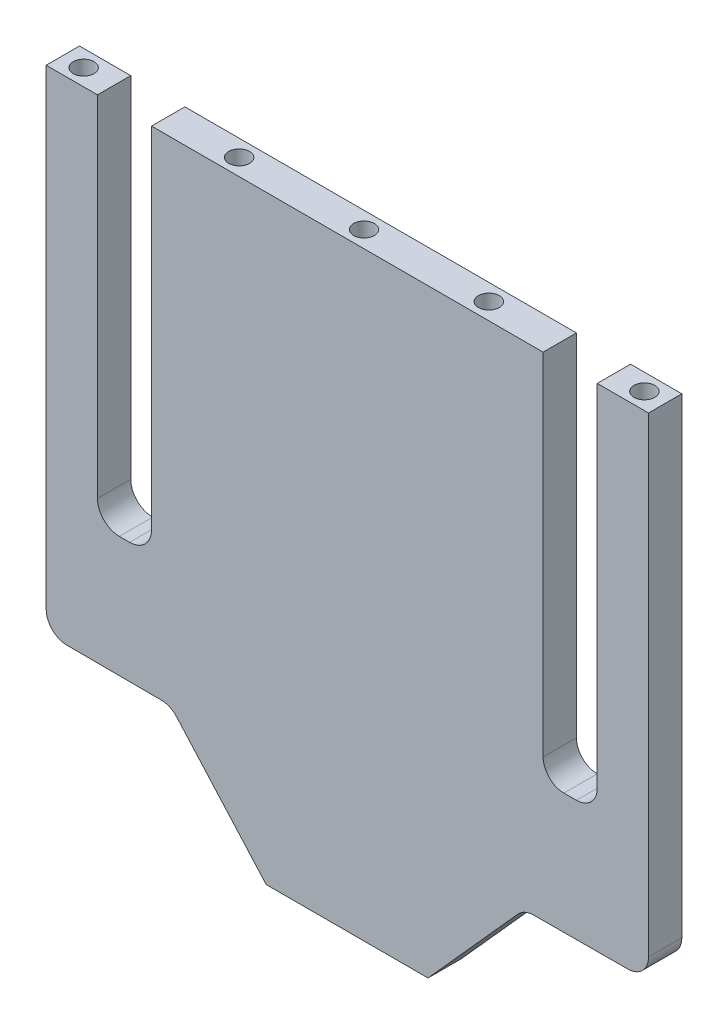
ISO-10303-21;
HEADER;
FILE_DESCRIPTION(('STEP AP214'),'2;1');
FILE_NAME('part.step','',(''),(''),'','','');
FILE_SCHEMA(('AUTOMOTIVE_DESIGN { 1 0 10303 214 1 1 1 1 }'));
ENDSEC;
DATA;
#1=APPLICATION_CONTEXT('core data for automotive mechanical design processes');
#2=APPLICATION_PROTOCOL_DEFINITION('international standard','automotive_design',2000,#1);
#3=PRODUCT_CONTEXT('',#1,'mechanical');
#4=PRODUCT('Part','Part','',(#3));
#5=PRODUCT_RELATED_PRODUCT_CATEGORY('part','',(#4));
#6=PRODUCT_DEFINITION_FORMATION('','',#4);
#7=PRODUCT_DEFINITION_CONTEXT('part definition',#1,'design');
#8=PRODUCT_DEFINITION('design','',#6,#7);
#9=PRODUCT_DEFINITION_SHAPE('','',#8);
#10=(LENGTH_UNIT() NAMED_UNIT(*) SI_UNIT(.MILLI.,.METRE.));
#11=(NAMED_UNIT(*) PLANE_ANGLE_UNIT() SI_UNIT($,.RADIAN.));
#12=(NAMED_UNIT(*) SI_UNIT($,.STERADIAN.) SOLID_ANGLE_UNIT());
#13=UNCERTAINTY_MEASURE_WITH_UNIT(LENGTH_MEASURE(1.E-05),#10,'distance_accuracy_value','');
#14=(GEOMETRIC_REPRESENTATION_CONTEXT(3) GLOBAL_UNCERTAINTY_ASSIGNED_CONTEXT((#13)) GLOBAL_UNIT_ASSIGNED_CONTEXT((#10,
#11,#12)) REPRESENTATION_CONTEXT('',''));
#15=CARTESIAN_POINT('',(0.,0.,0.));
#16=DIRECTION('',(0.,0.,1.));
#17=DIRECTION('',(1.,0.,0.));
#18=AXIS2_PLACEMENT_3D('',#15,#16,#17);
#19=CARTESIAN_POINT('',(142.361429131202,144.052259170068,8.01));
#20=DIRECTION('',(0.,-1.,0.));
#21=DIRECTION('',(0.,0.,-1.));
#22=AXIS2_PLACEMENT_3D('',#19,#20,#21);
#23=PLANE('',#22);
#24=CARTESIAN_POINT('',(2.63857086880265,144.052259170068,4.));
#25=DIRECTION('',(0.,-1.,0.));
#26=DIRECTION('',(0.,0.,-1.));
#27=AXIS2_PLACEMENT_3D('',#24,#25,#26);
#28=CIRCLE('',#27,2.5);
#29=CARTESIAN_POINT('',(2.63857086880265,144.052259170068,1.5));
#30=VERTEX_POINT('',#29);
#31=EDGE_CURVE('E467',#30,#30,#28,.T.);
#32=ORIENTED_EDGE('',*,*,#31,.T.);
#33=EDGE_LOOP('',(#32));
#34=FACE_BOUND('',#33,.T.);
#35=DIRECTION('',(1.,0.,0.));
#36=VECTOR('',#35,1.);
#37=CARTESIAN_POINT('',(114.734330831104,144.052259170068,8.));
#38=LINE('',#37,#36);
#39=CARTESIAN_POINT('',(-2.3614291311915,144.052259170068,8.));
#40=VERTEX_POINT('',#39);
#41=CARTESIAN_POINT('',(9.96045656366648,144.052259170068,8.));
#42=VERTEX_POINT('',#41);
#43=EDGE_CURVE('E375',#40,#42,#38,.T.);
#44=ORIENTED_EDGE('',*,*,#43,.T.);
#45=DIRECTION('',(0.,0.,-1.));
#46=VECTOR('',#45,1.);
#47=CARTESIAN_POINT('',(9.96045656366648,144.052259170068,8.));
#48=LINE('',#47,#46);
#49=CARTESIAN_POINT('',(9.96045656366648,144.052259170068,0.));
#50=VERTEX_POINT('',#49);
#51=EDGE_CURVE('E45',#42,#50,#48,.T.);
#52=ORIENTED_EDGE('',*,*,#51,.T.);
#53=DIRECTION('',(1.,0.,0.));
#54=VECTOR('',#53,1.);
#55=CARTESIAN_POINT('',(114.734330831104,144.052259170068,0.));
#56=LINE('',#55,#54);
#57=CARTESIAN_POINT('',(-2.3614291311915,144.052259170068,0.));
#58=VERTEX_POINT('',#57);
#59=EDGE_CURVE('E372',#58,#50,#56,.T.);
#60=ORIENTED_EDGE('',*,*,#59,.F.);
#61=DIRECTION('',(0.,0.,-1.));
#62=VECTOR('',#61,1.);
#63=CARTESIAN_POINT('',(-2.3614291311915,144.052259170068,8.));
#64=LINE('',#63,#62);
#65=EDGE_CURVE('E365',#40,#58,#64,.T.);
#66=ORIENTED_EDGE('',*,*,#65,.F.);
#67=EDGE_LOOP('',(#44,#52,#60,#66));
#68=FACE_BOUND('',#67,.T.);
#69=ADVANCED_FACE('F41',(#34,#68),#23,.F.);
#70=CARTESIAN_POINT('',(137.361429131207,144.052259170068,4.));
#71=DIRECTION('',(0.,-1.,0.));
#72=DIRECTION('',(0.,0.,-1.));
#73=AXIS2_PLACEMENT_3D('',#70,#71,#72);
#74=CIRCLE('',#73,2.5);
#75=CARTESIAN_POINT('',(137.361429131207,144.052259170068,1.50000000000001));
#76=VERTEX_POINT('',#75);
#77=EDGE_CURVE('E488',#76,#76,#74,.T.);
#78=ORIENTED_EDGE('',*,*,#77,.T.);
#79=EDGE_LOOP('',(#78));
#80=FACE_BOUND('',#79,.T.);
#81=CARTESIAN_POINT('',(130.039543436344,144.052259170068,8.));
#82=VERTEX_POINT('',#81);
#83=CARTESIAN_POINT('',(142.361429131201,144.052259170068,8.));
#84=VERTEX_POINT('',#83);
#85=EDGE_CURVE('E229',#82,#84,#38,.T.);
#86=ORIENTED_EDGE('',*,*,#85,.T.);
#87=DIRECTION('',(0.,0.,1.));
#88=VECTOR('',#87,1.);
#89=CARTESIAN_POINT('',(142.361429131201,144.052259170068,8.));
#90=LINE('',#89,#88);
#91=CARTESIAN_POINT('',(142.361429131201,144.052259170068,0.));
#92=VERTEX_POINT('',#91);
#93=EDGE_CURVE('E368',#92,#84,#90,.T.);
#94=ORIENTED_EDGE('',*,*,#93,.F.);
#95=CARTESIAN_POINT('',(130.039543436344,144.052259170068,0.));
#96=VERTEX_POINT('',#95);
#97=EDGE_CURVE('E370',#96,#92,#56,.T.);
#98=ORIENTED_EDGE('',*,*,#97,.F.);
#99=DIRECTION('',(0.,0.,1.));
#100=VECTOR('',#99,1.);
#101=CARTESIAN_POINT('',(130.039543436344,144.052259170068,8.));
#102=LINE('',#101,#100);
#103=EDGE_CURVE('E50',#96,#82,#102,.T.);
#104=ORIENTED_EDGE('',*,*,#103,.T.);
#105=EDGE_LOOP('',(#86,#94,#98,#104));
#106=FACE_BOUND('',#105,.T.);
#107=ADVANCED_FACE('F380',(#80,#106),#23,.F.);
#108=CARTESIAN_POINT('',(40.,144.052259170068,4.));
#109=DIRECTION('',(0.,-1.,0.));
#110=DIRECTION('',(0.,0.,-1.));
#111=AXIS2_PLACEMENT_3D('',#108,#109,#110);
#112=CIRCLE('',#111,2.5);
#113=CARTESIAN_POINT('',(40.,144.052259170068,1.50000000000001));
#114=VERTEX_POINT('',#113);
#115=EDGE_CURVE('E469',#114,#114,#112,.T.);
#116=ORIENTED_EDGE('',*,*,#115,.T.);
#117=EDGE_LOOP('',(#116));
#118=FACE_BOUND('',#117,.T.);
#119=CARTESIAN_POINT('',(70.,144.052259170068,4.));
#120=DIRECTION('',(0.,-1.,0.));
#121=DIRECTION('',(0.,0.,-1.));
#122=AXIS2_PLACEMENT_3D('',#119,#120,#121);
#123=CIRCLE('',#122,2.5);
#124=CARTESIAN_POINT('',(70.,144.052259170068,1.50000000000001));
#125=VERTEX_POINT('',#124);
#126=EDGE_CURVE('E476',#125,#125,#123,.T.);
#127=ORIENTED_EDGE('',*,*,#126,.T.);
#128=EDGE_LOOP('',(#127));
#129=FACE_BOUND('',#128,.T.);
#130=CARTESIAN_POINT('',(100.,144.052259170068,4.));
#131=DIRECTION('',(0.,-1.,0.));
#132=DIRECTION('',(0.,0.,-1.));
#133=AXIS2_PLACEMENT_3D('',#130,#131,#132);
#134=CIRCLE('',#133,2.5);
#135=CARTESIAN_POINT('',(100.,144.052259170068,1.50000000000001));
#136=VERTEX_POINT('',#135);
#137=EDGE_CURVE('E482',#136,#136,#134,.T.);
#138=ORIENTED_EDGE('',*,*,#137,.T.);
#139=EDGE_LOOP('',(#138));
#140=FACE_BOUND('',#139,.T.);
#141=DIRECTION('',(0.,0.,1.));
#142=VECTOR('',#141,1.);
#143=CARTESIAN_POINT('',(22.9604457068742,144.052259170068,8.));
#144=LINE('',#143,#142);
#145=CARTESIAN_POINT('',(22.9604457068742,144.052259170068,0.));
#146=VERTEX_POINT('',#145);
#147=CARTESIAN_POINT('',(22.9604457068742,144.052259170068,8.));
#148=VERTEX_POINT('',#147);
#149=EDGE_CURVE('E376',#146,#148,#144,.T.);
#150=ORIENTED_EDGE('',*,*,#149,.T.);
#151=CARTESIAN_POINT('',(117.039554293136,144.052259170068,8.));
#152=VERTEX_POINT('',#151);
#153=EDGE_CURVE('E374',#148,#152,#38,.T.);
#154=ORIENTED_EDGE('',*,*,#153,.T.);
#155=DIRECTION('',(0.,0.,-1.));
#156=VECTOR('',#155,1.);
#157=CARTESIAN_POINT('',(117.039554293136,144.052259170068,8.));
#158=LINE('',#157,#156);
#159=CARTESIAN_POINT('',(117.039554293136,144.052259170068,0.));
#160=VERTEX_POINT('',#159);
#161=EDGE_CURVE('E11',#152,#160,#158,.T.);
#162=ORIENTED_EDGE('',*,*,#161,.T.);
#163=EDGE_CURVE('E58',#146,#160,#56,.T.);
#164=ORIENTED_EDGE('',*,*,#163,.F.);
#165=EDGE_LOOP('',(#150,#154,#162,#164));
#166=FACE_BOUND('',#165,.T.);
#167=ADVANCED_FACE('F43',(#118,#129,#140,#166),#23,.F.);
#168=CARTESIAN_POINT('',(114.734330831104,20.7823478267735,8.));
#169=DIRECTION('',(0.,0.,1.));
#170=DIRECTION('',(1.,0.,0.));
#171=AXIS2_PLACEMENT_3D('',#168,#169,#170);
#172=PLANE('',#171);
#173=ORIENTED_EDGE('',*,*,#43,.F.);
#174=DIRECTION('',(0.,-1.,0.));
#175=VECTOR('',#174,1.);
#176=CARTESIAN_POINT('',(-2.3614291311915,214.274017901078,8.));
#177=LINE('',#176,#175);
#178=CARTESIAN_POINT('',(-2.36142913119149,30.8599431741363,8.));
#179=VERTEX_POINT('',#178);
#180=EDGE_CURVE('E306',#40,#179,#177,.T.);
#181=ORIENTED_EDGE('',*,*,#180,.T.);
#182=CARTESIAN_POINT('',(2.63857086880851,30.8599431741363,8.));
#183=DIRECTION('',(0.,0.,1.));
#184=DIRECTION('',(-1.,0.,0.));
#185=AXIS2_PLACEMENT_3D('',#182,#183,#184);
#186=CIRCLE('',#185,5.);
#187=CARTESIAN_POINT('',(2.63857086880812,25.8599431741363,8.));
#188=VERTEX_POINT('',#187);
#189=EDGE_CURVE('E308',#179,#188,#186,.T.);
#190=ORIENTED_EDGE('',*,*,#189,.T.);
#191=DIRECTION('',(0.999994124417924,-0.00342799206976642,0.));
#192=VECTOR('',#191,1.);
#193=CARTESIAN_POINT('',(25.2828091292453,25.7823184488632,8.));
#194=LINE('',#193,#192);
#195=CARTESIAN_POINT('',(25.2828091292453,25.7823184488632,8.));
#196=VERTEX_POINT('',#195);
#197=EDGE_CURVE('E310',#188,#196,#194,.T.);
#198=ORIENTED_EDGE('',*,*,#197,.T.);
#199=CARTESIAN_POINT('',(25.2656691688965,20.7823478267735,8.));
#200=DIRECTION('',(0.,0.,-1.));
#201=DIRECTION('',(-1.,0.,0.));
#202=AXIS2_PLACEMENT_3D('',#199,#200,#201);
#203=CIRCLE('',#202,5.);
#204=CARTESIAN_POINT('',(28.9972260111802,24.1103327325094,8.));
#205=VERTEX_POINT('',#204);
#206=EDGE_CURVE('E312',#196,#205,#203,.T.);
#207=ORIENTED_EDGE('',*,*,#206,.T.);
#208=DIRECTION('',(0.665596981147171,-0.74631136845674,0.));
#209=VECTOR('',#208,1.);
#210=CARTESIAN_POINT('',(28.9972260111802,24.1103327325094,8.));
#211=LINE('',#210,#209);
#212=CARTESIAN_POINT('',(50.5,0.,8.));
#213=VERTEX_POINT('',#212);
#214=EDGE_CURVE('E290',#205,#213,#211,.T.);
#215=ORIENTED_EDGE('',*,*,#214,.T.);
#216=DIRECTION('',(1.,0.,0.));
#217=VECTOR('',#216,1.);
#218=CARTESIAN_POINT('',(89.3828592898621,0.,8.));
#219=LINE('',#218,#217);
#220=CARTESIAN_POINT('',(89.3828592898621,0.,8.));
#221=VERTEX_POINT('',#220);
#222=EDGE_CURVE('E293',#213,#221,#219,.T.);
#223=ORIENTED_EDGE('',*,*,#222,.T.);
#224=DIRECTION('',(0.667609283497738,0.744511816284763,0.));
#225=VECTOR('',#224,1.);
#226=CARTESIAN_POINT('',(89.3828592898621,0.,8.));
#227=LINE('',#226,#225);
#228=CARTESIAN_POINT('',(111.00277398882,24.1103327325094,8.));
#229=VERTEX_POINT('',#228);
#230=EDGE_CURVE('E296',#221,#229,#227,.T.);
#231=ORIENTED_EDGE('',*,*,#230,.T.);
#232=CARTESIAN_POINT('',(114.734330831104,20.7823478267735,8.));
#233=DIRECTION('',(0.,0.,-1.));
#234=DIRECTION('',(1.,0.,0.));
#235=AXIS2_PLACEMENT_3D('',#232,#233,#234);
#236=CIRCLE('',#235,5.);
#237=CARTESIAN_POINT('',(114.717190870755,25.7823184488632,8.));
#238=VERTEX_POINT('',#237);
#239=EDGE_CURVE('E298',#229,#238,#236,.T.);
#240=ORIENTED_EDGE('',*,*,#239,.T.);
#241=DIRECTION('',(0.999994124417924,0.00342799206976557,0.));
#242=VECTOR('',#241,1.);
#243=CARTESIAN_POINT('',(114.717190870755,25.7823184488632,8.));
#244=LINE('',#243,#242);
#245=CARTESIAN_POINT('',(137.361429131203,25.8599431741363,8.));
#246=VERTEX_POINT('',#245);
#247=EDGE_CURVE('E300',#238,#246,#244,.T.);
#248=ORIENTED_EDGE('',*,*,#247,.T.);
#249=CARTESIAN_POINT('',(137.361429131202,30.8599431741363,8.));
#250=DIRECTION('',(0.,0.,1.));
#251=DIRECTION('',(1.,0.,0.));
#252=AXIS2_PLACEMENT_3D('',#249,#250,#251);
#253=CIRCLE('',#252,4.99999999999935);
#254=CARTESIAN_POINT('',(142.361429131202,30.8599431741363,8.));
#255=VERTEX_POINT('',#254);
#256=EDGE_CURVE('E302',#246,#255,#253,.T.);
#257=ORIENTED_EDGE('',*,*,#256,.T.);
#258=DIRECTION('',(0.,1.,0.));
#259=VECTOR('',#258,1.);
#260=CARTESIAN_POINT('',(142.361429131201,214.274017901078,8.));
#261=LINE('',#260,#259);
#262=EDGE_CURVE('E304',#255,#84,#261,.T.);
#263=ORIENTED_EDGE('',*,*,#262,.T.);
#264=ORIENTED_EDGE('',*,*,#85,.F.);
#265=DIRECTION('',(0.,1.,0.));
#266=VECTOR('',#265,1.);
#267=CARTESIAN_POINT('',(130.039543436344,189.807228462391,8.));
#268=LINE('',#267,#266);
#269=CARTESIAN_POINT('',(130.039543436344,59.8072284623908,8.));
#270=VERTEX_POINT('',#269);
#271=EDGE_CURVE('E213',#270,#82,#268,.T.);
#272=ORIENTED_EDGE('',*,*,#271,.F.);
#273=CARTESIAN_POINT('',(125.039543436344,59.8072284623908,8.));
#274=DIRECTION('',(0.,0.,1.));
#275=DIRECTION('',(1.,0.,0.));
#276=AXIS2_PLACEMENT_3D('',#273,#274,#275);
#277=CIRCLE('',#276,5.);
#278=CARTESIAN_POINT('',(125.039543436344,54.8072284623908,8.));
#279=VERTEX_POINT('',#278);
#280=EDGE_CURVE('E203',#279,#270,#277,.T.);
#281=ORIENTED_EDGE('',*,*,#280,.F.);
#282=DIRECTION('',(1.,0.,0.));
#283=VECTOR('',#282,1.);
#284=CARTESIAN_POINT('',(125.039543436344,54.8072284623908,8.));
#285=LINE('',#284,#283);
#286=CARTESIAN_POINT('',(122.039554293136,54.8072284623908,8.));
#287=VERTEX_POINT('',#286);
#288=EDGE_CURVE('E238',#287,#279,#285,.T.);
#289=ORIENTED_EDGE('',*,*,#288,.F.);
#290=CARTESIAN_POINT('',(122.039554293136,59.8072284623908,8.));
#291=DIRECTION('',(0.,0.,1.));
#292=DIRECTION('',(-1.,0.,0.));
#293=AXIS2_PLACEMENT_3D('',#290,#291,#292);
#294=CIRCLE('',#293,4.99999999999999);
#295=CARTESIAN_POINT('',(117.039554293137,59.8072284623908,8.));
#296=VERTEX_POINT('',#295);
#297=EDGE_CURVE('E232',#296,#287,#294,.T.);
#298=ORIENTED_EDGE('',*,*,#297,.F.);
#299=DIRECTION('',(0.,-1.,0.));
#300=VECTOR('',#299,1.);
#301=CARTESIAN_POINT('',(117.039554293137,59.8072284623908,8.));
#302=LINE('',#301,#300);
#303=EDGE_CURVE('E230',#152,#296,#302,.T.);
#304=ORIENTED_EDGE('',*,*,#303,.F.);
#305=ORIENTED_EDGE('',*,*,#153,.F.);
#306=DIRECTION('',(0.,1.,0.));
#307=VECTOR('',#306,1.);
#308=CARTESIAN_POINT('',(22.9604457068742,60.0655706645121,8.));
#309=LINE('',#308,#307);
#310=CARTESIAN_POINT('',(22.9604457068742,60.0655706645121,8.));
#311=VERTEX_POINT('',#310);
#312=EDGE_CURVE('E266',#311,#148,#309,.T.);
#313=ORIENTED_EDGE('',*,*,#312,.F.);
#314=CARTESIAN_POINT('',(17.7021035047529,60.0655706645121,8.));
#315=DIRECTION('',(0.,0.,1.));
#316=DIRECTION('',(1.,0.,0.));
#317=AXIS2_PLACEMENT_3D('',#314,#315,#316);
#318=CIRCLE('',#317,5.25834220212128);
#319=CARTESIAN_POINT('',(17.7021035047529,54.8072284623908,8.));
#320=VERTEX_POINT('',#319);
#321=EDGE_CURVE('E263',#320,#311,#318,.T.);
#322=ORIENTED_EDGE('',*,*,#321,.F.);
#323=DIRECTION('',(1.,0.,0.));
#324=VECTOR('',#323,1.);
#325=CARTESIAN_POINT('',(15.2187987657878,54.8072284623908,8.));
#326=LINE('',#325,#324);
#327=CARTESIAN_POINT('',(15.2187987657878,54.8072284623908,8.));
#328=VERTEX_POINT('',#327);
#329=EDGE_CURVE('E261',#328,#320,#326,.T.);
#330=ORIENTED_EDGE('',*,*,#329,.F.);
#331=CARTESIAN_POINT('',(15.2187987657878,60.0655706645121,8.));
#332=DIRECTION('',(0.,0.,1.));
#333=DIRECTION('',(-1.,0.,0.));
#334=AXIS2_PLACEMENT_3D('',#331,#332,#333);
#335=CIRCLE('',#334,5.25834220212128);
#336=CARTESIAN_POINT('',(9.96045656366648,60.0655706645121,8.));
#337=VERTEX_POINT('',#336);
#338=EDGE_CURVE('E258',#337,#328,#335,.T.);
#339=ORIENTED_EDGE('',*,*,#338,.F.);
#340=DIRECTION('',(0.,-1.,0.));
#341=VECTOR('',#340,1.);
#342=CARTESIAN_POINT('',(9.96045656366648,189.807228462391,8.));
#343=LINE('',#342,#341);
#344=EDGE_CURVE('E256',#42,#337,#343,.T.);
#345=ORIENTED_EDGE('',*,*,#344,.F.);
#346=EDGE_LOOP('',(#173,#181,#190,#198,#207,#215,#223,#231,#240,#248,#257,#263,#264,#272,#281,
#289,#298,#304,#305,#313,#322,#330,#339,#345));
#347=FACE_BOUND('',#346,.T.);
#348=ADVANCED_FACE('F226',(#347),#172,.T.);
#349=CARTESIAN_POINT('',(114.734330831104,20.7823478267735,0.));
#350=DIRECTION('',(0.,0.,1.));
#351=DIRECTION('',(1.,0.,0.));
#352=AXIS2_PLACEMENT_3D('',#349,#350,#351);
#353=PLANE('',#352);
#354=DIRECTION('',(0.,-1.,0.));
#355=VECTOR('',#354,1.);
#356=CARTESIAN_POINT('',(-2.3614291311915,214.274017901078,0.));
#357=LINE('',#356,#355);
#358=CARTESIAN_POINT('',(-2.36142913119149,30.8599431741363,0.));
#359=VERTEX_POINT('',#358);
#360=EDGE_CURVE('E330',#58,#359,#357,.T.);
#361=ORIENTED_EDGE('',*,*,#360,.F.);
#362=ORIENTED_EDGE('',*,*,#59,.T.);
#363=DIRECTION('',(0.,-1.,0.));
#364=VECTOR('',#363,1.);
#365=CARTESIAN_POINT('',(9.96045656366648,189.807228462391,0.));
#366=LINE('',#365,#364);
#367=CARTESIAN_POINT('',(9.96045656366648,60.0655706645121,0.));
#368=VERTEX_POINT('',#367);
#369=EDGE_CURVE('E221',#50,#368,#366,.T.);
#370=ORIENTED_EDGE('',*,*,#369,.T.);
#371=CARTESIAN_POINT('',(15.2187987657878,60.0655706645121,0.));
#372=DIRECTION('',(0.,0.,1.));
#373=DIRECTION('',(-1.,0.,0.));
#374=AXIS2_PLACEMENT_3D('',#371,#372,#373);
#375=CIRCLE('',#374,5.25834220212128);
#376=CARTESIAN_POINT('',(15.2187987657878,54.8072284623908,0.));
#377=VERTEX_POINT('',#376);
#378=EDGE_CURVE('E271',#368,#377,#375,.T.);
#379=ORIENTED_EDGE('',*,*,#378,.T.);
#380=DIRECTION('',(1.,0.,0.));
#381=VECTOR('',#380,1.);
#382=CARTESIAN_POINT('',(15.2187987657878,54.8072284623908,0.));
#383=LINE('',#382,#381);
#384=CARTESIAN_POINT('',(17.7021035047529,54.8072284623908,0.));
#385=VERTEX_POINT('',#384);
#386=EDGE_CURVE('E274',#377,#385,#383,.T.);
#387=ORIENTED_EDGE('',*,*,#386,.T.);
#388=CARTESIAN_POINT('',(17.7021035047529,60.0655706645121,0.));
#389=DIRECTION('',(0.,0.,1.));
#390=DIRECTION('',(1.,0.,0.));
#391=AXIS2_PLACEMENT_3D('',#388,#389,#390);
#392=CIRCLE('',#391,5.25834220212128);
#393=CARTESIAN_POINT('',(22.9604457068742,60.0655706645121,0.));
#394=VERTEX_POINT('',#393);
#395=EDGE_CURVE('E277',#385,#394,#392,.T.);
#396=ORIENTED_EDGE('',*,*,#395,.T.);
#397=DIRECTION('',(0.,1.,0.));
#398=VECTOR('',#397,1.);
#399=CARTESIAN_POINT('',(22.9604457068742,60.0655706645121,0.));
#400=LINE('',#399,#398);
#401=EDGE_CURVE('E259',#394,#146,#400,.T.);
#402=ORIENTED_EDGE('',*,*,#401,.T.);
#403=ORIENTED_EDGE('',*,*,#163,.T.);
#404=DIRECTION('',(0.,-1.,0.));
#405=VECTOR('',#404,1.);
#406=CARTESIAN_POINT('',(117.039554293137,59.8072284623908,0.));
#407=LINE('',#406,#405);
#408=CARTESIAN_POINT('',(117.039554293137,59.8072284623908,0.));
#409=VERTEX_POINT('',#408);
#410=EDGE_CURVE('E244',#160,#409,#407,.T.);
#411=ORIENTED_EDGE('',*,*,#410,.T.);
#412=CARTESIAN_POINT('',(122.039554293136,59.8072284623908,0.));
#413=DIRECTION('',(0.,0.,1.));
#414=DIRECTION('',(-1.,0.,0.));
#415=AXIS2_PLACEMENT_3D('',#412,#413,#414);
#416=CIRCLE('',#415,4.99999999999999);
#417=CARTESIAN_POINT('',(122.039554293136,54.8072284623908,0.));
#418=VERTEX_POINT('',#417);
#419=EDGE_CURVE('E246',#409,#418,#416,.T.);
#420=ORIENTED_EDGE('',*,*,#419,.T.);
#421=DIRECTION('',(1.,0.,0.));
#422=VECTOR('',#421,1.);
#423=CARTESIAN_POINT('',(125.039543436344,54.8072284623908,0.));
#424=LINE('',#423,#422);
#425=CARTESIAN_POINT('',(125.039543436344,54.8072284623908,0.));
#426=VERTEX_POINT('',#425);
#427=EDGE_CURVE('E214',#418,#426,#424,.T.);
#428=ORIENTED_EDGE('',*,*,#427,.T.);
#429=CARTESIAN_POINT('',(125.039543436344,59.8072284623908,0.));
#430=DIRECTION('',(0.,0.,1.));
#431=DIRECTION('',(1.,0.,0.));
#432=AXIS2_PLACEMENT_3D('',#429,#430,#431);
#433=CIRCLE('',#432,5.);
#434=CARTESIAN_POINT('',(130.039543436344,59.8072284623908,0.));
#435=VERTEX_POINT('',#434);
#436=EDGE_CURVE('E240',#426,#435,#433,.T.);
#437=ORIENTED_EDGE('',*,*,#436,.T.);
#438=DIRECTION('',(0.,1.,0.));
#439=VECTOR('',#438,1.);
#440=CARTESIAN_POINT('',(130.039543436344,189.807228462391,0.));
#441=LINE('',#440,#439);
#442=EDGE_CURVE('E220',#435,#96,#441,.T.);
#443=ORIENTED_EDGE('',*,*,#442,.T.);
#444=ORIENTED_EDGE('',*,*,#97,.T.);
#445=DIRECTION('',(0.,1.,0.));
#446=VECTOR('',#445,1.);
#447=CARTESIAN_POINT('',(142.361429131201,214.274017901078,0.));
#448=LINE('',#447,#446);
#449=CARTESIAN_POINT('',(142.361429131202,30.8599431741363,0.));
#450=VERTEX_POINT('',#449);
#451=EDGE_CURVE('E327',#450,#92,#448,.T.);
#452=ORIENTED_EDGE('',*,*,#451,.F.);
#453=CARTESIAN_POINT('',(137.361429131202,30.8599431741363,0.));
#454=DIRECTION('',(0.,0.,1.));
#455=DIRECTION('',(1.,0.,0.));
#456=AXIS2_PLACEMENT_3D('',#453,#454,#455);
#457=CIRCLE('',#456,4.99999999999935);
#458=CARTESIAN_POINT('',(137.361429131203,25.8599431741363,0.));
#459=VERTEX_POINT('',#458);
#460=EDGE_CURVE('E325',#459,#450,#457,.T.);
#461=ORIENTED_EDGE('',*,*,#460,.F.);
#462=DIRECTION('',(0.999994124417924,0.00342799206976557,0.));
#463=VECTOR('',#462,1.);
#464=CARTESIAN_POINT('',(114.717190870755,25.7823184488632,0.));
#465=LINE('',#464,#463);
#466=CARTESIAN_POINT('',(114.717190870755,25.7823184488632,0.));
#467=VERTEX_POINT('',#466);
#468=EDGE_CURVE('E323',#467,#459,#465,.T.);
#469=ORIENTED_EDGE('',*,*,#468,.F.);
#470=CARTESIAN_POINT('',(114.734330831104,20.7823478267735,0.));
#471=DIRECTION('',(0.,0.,-1.));
#472=DIRECTION('',(1.,0.,0.));
#473=AXIS2_PLACEMENT_3D('',#470,#471,#472);
#474=CIRCLE('',#473,5.);
#475=CARTESIAN_POINT('',(111.00277398882,24.1103327325094,0.));
#476=VERTEX_POINT('',#475);
#477=EDGE_CURVE('E321',#476,#467,#474,.T.);
#478=ORIENTED_EDGE('',*,*,#477,.F.);
#479=DIRECTION('',(0.667609283497738,0.744511816284763,0.));
#480=VECTOR('',#479,1.);
#481=CARTESIAN_POINT('',(89.3828592898621,0.,0.));
#482=LINE('',#481,#480);
#483=CARTESIAN_POINT('',(89.3828592898621,0.,0.));
#484=VERTEX_POINT('',#483);
#485=EDGE_CURVE('E319',#484,#476,#482,.T.);
#486=ORIENTED_EDGE('',*,*,#485,.F.);
#487=DIRECTION('',(1.,0.,0.));
#488=VECTOR('',#487,1.);
#489=CARTESIAN_POINT('',(89.3828592898621,0.,0.));
#490=LINE('',#489,#488);
#491=CARTESIAN_POINT('',(50.5,0.,0.));
#492=VERTEX_POINT('',#491);
#493=EDGE_CURVE('E317',#492,#484,#490,.T.);
#494=ORIENTED_EDGE('',*,*,#493,.F.);
#495=DIRECTION('',(0.665596981147171,-0.74631136845674,0.));
#496=VECTOR('',#495,1.);
#497=CARTESIAN_POINT('',(28.9972260111802,24.1103327325094,0.));
#498=LINE('',#497,#496);
#499=CARTESIAN_POINT('',(28.9972260111802,24.1103327325094,0.));
#500=VERTEX_POINT('',#499);
#501=EDGE_CURVE('E289',#500,#492,#498,.T.);
#502=ORIENTED_EDGE('',*,*,#501,.F.);
#503=CARTESIAN_POINT('',(25.2656691688965,20.7823478267735,0.));
#504=DIRECTION('',(0.,0.,-1.));
#505=DIRECTION('',(-1.,0.,0.));
#506=AXIS2_PLACEMENT_3D('',#503,#504,#505);
#507=CIRCLE('',#506,5.);
#508=CARTESIAN_POINT('',(25.2828091292453,25.7823184488632,0.));
#509=VERTEX_POINT('',#508);
#510=EDGE_CURVE('E294',#509,#500,#507,.T.);
#511=ORIENTED_EDGE('',*,*,#510,.F.);
#512=DIRECTION('',(0.999994124417924,-0.00342799206976642,0.));
#513=VECTOR('',#512,1.);
#514=CARTESIAN_POINT('',(25.2828091292453,25.7823184488632,0.));
#515=LINE('',#514,#513);
#516=CARTESIAN_POINT('',(2.63857086880812,25.8599431741363,0.));
#517=VERTEX_POINT('',#516);
#518=EDGE_CURVE('E334',#517,#509,#515,.T.);
#519=ORIENTED_EDGE('',*,*,#518,.F.);
#520=CARTESIAN_POINT('',(2.63857086880851,30.8599431741363,0.));
#521=DIRECTION('',(0.,0.,1.));
#522=DIRECTION('',(-1.,0.,0.));
#523=AXIS2_PLACEMENT_3D('',#520,#521,#522);
#524=CIRCLE('',#523,5.);
#525=EDGE_CURVE('E332',#359,#517,#524,.T.);
#526=ORIENTED_EDGE('',*,*,#525,.F.);
#527=EDGE_LOOP('',(#361,#362,#370,#379,#387,#396,#402,#403,#411,#420,#428,#437,#443,#444,#452,
#461,#469,#478,#486,#494,#502,#511,#519,#526));
#528=FACE_BOUND('',#527,.T.);
#529=ADVANCED_FACE('F384',(#528),#353,.F.);
#530=CARTESIAN_POINT('',(28.9972260111802,24.1103327325094,8.));
#531=DIRECTION('',(0.74631136845674,0.665596981147171,0.));
#532=DIRECTION('',(-0.665596981147171,0.74631136845674,0.));
#533=AXIS2_PLACEMENT_3D('',#530,#531,#532);
#534=PLANE('',#533);
#535=ORIENTED_EDGE('',*,*,#501,.T.);
#536=DIRECTION('',(0.,0.,-1.));
#537=VECTOR('',#536,1.);
#538=CARTESIAN_POINT('',(50.5,0.,8.));
#539=LINE('',#538,#537);
#540=EDGE_CURVE('E363',#213,#492,#539,.T.);
#541=ORIENTED_EDGE('',*,*,#540,.F.);
#542=ORIENTED_EDGE('',*,*,#214,.F.);
#543=DIRECTION('',(0.,0.,-1.));
#544=VECTOR('',#543,1.);
#545=CARTESIAN_POINT('',(28.9972260111802,24.1103327325094,8.));
#546=LINE('',#545,#544);
#547=EDGE_CURVE('E314',#205,#500,#546,.T.);
#548=ORIENTED_EDGE('',*,*,#547,.T.);
#549=EDGE_LOOP('',(#535,#541,#542,#548));
#550=FACE_BOUND('',#549,.T.);
#551=ADVANCED_FACE('F545',(#550),#534,.F.);
#552=CARTESIAN_POINT('',(89.3828592898621,0.,8.));
#553=DIRECTION('',(0.,1.,0.));
#554=DIRECTION('',(0.,0.,1.));
#555=AXIS2_PLACEMENT_3D('',#552,#553,#554);
#556=PLANE('',#555);
#557=ORIENTED_EDGE('',*,*,#493,.T.);
#558=DIRECTION('',(0.,0.,-1.));
#559=VECTOR('',#558,1.);
#560=CARTESIAN_POINT('',(89.3828592898621,0.,8.));
#561=LINE('',#560,#559);
#562=EDGE_CURVE('E360',#221,#484,#561,.T.);
#563=ORIENTED_EDGE('',*,*,#562,.F.);
#564=ORIENTED_EDGE('',*,*,#222,.F.);
#565=ORIENTED_EDGE('',*,*,#540,.T.);
#566=EDGE_LOOP('',(#557,#563,#564,#565));
#567=FACE_BOUND('',#566,.T.);
#568=ADVANCED_FACE('F580',(#567),#556,.F.);
#569=CARTESIAN_POINT('',(89.3828592898621,0.,8.));
#570=DIRECTION('',(-0.744511816284763,0.667609283497738,0.));
#571=DIRECTION('',(-0.667609283497738,-0.744511816284763,0.));
#572=AXIS2_PLACEMENT_3D('',#569,#570,#571);
#573=PLANE('',#572);
#574=ORIENTED_EDGE('',*,*,#485,.T.);
#575=DIRECTION('',(0.,0.,-1.));
#576=VECTOR('',#575,1.);
#577=CARTESIAN_POINT('',(111.00277398882,24.1103327325094,8.));
#578=LINE('',#577,#576);
#579=EDGE_CURVE('E357',#229,#476,#578,.T.);
#580=ORIENTED_EDGE('',*,*,#579,.F.);
#581=ORIENTED_EDGE('',*,*,#230,.F.);
#582=ORIENTED_EDGE('',*,*,#562,.T.);
#583=EDGE_LOOP('',(#574,#580,#581,#582));
#584=FACE_BOUND('',#583,.T.);
#585=ADVANCED_FACE('F576',(#584),#573,.F.);
#586=CARTESIAN_POINT('',(114.734330831104,20.7823478267735,8.));
#587=DIRECTION('',(0.,0.,-1.));
#588=DIRECTION('',(-1.,0.,0.));
#589=AXIS2_PLACEMENT_3D('',#586,#587,#588);
#590=CYLINDRICAL_SURFACE('',#589,5.);
#591=ORIENTED_EDGE('',*,*,#477,.T.);
#592=DIRECTION('',(0.,0.,-1.));
#593=VECTOR('',#592,1.);
#594=CARTESIAN_POINT('',(114.717190870755,25.7823184488632,8.));
#595=LINE('',#594,#593);
#596=EDGE_CURVE('E354',#238,#467,#595,.T.);
#597=ORIENTED_EDGE('',*,*,#596,.F.);
#598=ORIENTED_EDGE('',*,*,#239,.F.);
#599=ORIENTED_EDGE('',*,*,#579,.T.);
#600=EDGE_LOOP('',(#591,#597,#598,#599));
#601=FACE_BOUND('',#600,.T.);
#602=ADVANCED_FACE('F572',(#601),#590,.F.);
#603=CARTESIAN_POINT('',(114.717190870755,25.7823184488632,8.));
#604=DIRECTION('',(-0.00342799206976556,0.999994124417924,0.));
#605=DIRECTION('',(-0.999994124417924,-0.00342799206976556,0.));
#606=AXIS2_PLACEMENT_3D('',#603,#604,#605);
#607=PLANE('',#606);
#608=ORIENTED_EDGE('',*,*,#468,.T.);
#609=DIRECTION('',(0.,0.,-1.));
#610=VECTOR('',#609,1.);
#611=CARTESIAN_POINT('',(137.361429131203,25.8599431741363,8.));
#612=LINE('',#611,#610);
#613=EDGE_CURVE('E351',#246,#459,#612,.T.);
#614=ORIENTED_EDGE('',*,*,#613,.F.);
#615=ORIENTED_EDGE('',*,*,#247,.F.);
#616=ORIENTED_EDGE('',*,*,#596,.T.);
#617=EDGE_LOOP('',(#608,#614,#615,#616));
#618=FACE_BOUND('',#617,.T.);
#619=ADVANCED_FACE('F568',(#618),#607,.F.);
#620=CARTESIAN_POINT('',(137.361429131202,30.8599431741363,8.));
#621=DIRECTION('',(0.,0.,-1.));
#622=DIRECTION('',(-1.,0.,0.));
#623=AXIS2_PLACEMENT_3D('',#620,#621,#622);
#624=CYLINDRICAL_SURFACE('',#623,4.99999999999935);
#625=ORIENTED_EDGE('',*,*,#460,.T.);
#626=DIRECTION('',(0.,0.,-1.));
#627=VECTOR('',#626,1.);
#628=CARTESIAN_POINT('',(142.361429131202,30.8599431741363,8.));
#629=LINE('',#628,#627);
#630=EDGE_CURVE('E348',#255,#450,#629,.T.);
#631=ORIENTED_EDGE('',*,*,#630,.F.);
#632=ORIENTED_EDGE('',*,*,#256,.F.);
#633=ORIENTED_EDGE('',*,*,#613,.T.);
#634=EDGE_LOOP('',(#625,#631,#632,#633));
#635=FACE_BOUND('',#634,.T.);
#636=ADVANCED_FACE('F564',(#635),#624,.T.);
#637=CARTESIAN_POINT('',(142.361429131201,214.274017901078,8.));
#638=DIRECTION('',(-1.,0.,0.));
#639=DIRECTION('',(0.,-1.,0.));
#640=AXIS2_PLACEMENT_3D('',#637,#638,#639);
#641=PLANE('',#640);
#642=ORIENTED_EDGE('',*,*,#451,.T.);
#643=ORIENTED_EDGE('',*,*,#93,.T.);
#644=ORIENTED_EDGE('',*,*,#262,.F.);
#645=ORIENTED_EDGE('',*,*,#630,.T.);
#646=EDGE_LOOP('',(#642,#643,#644,#645));
#647=FACE_BOUND('',#646,.T.);
#648=ADVANCED_FACE('F560',(#647),#641,.F.);
#649=CARTESIAN_POINT('',(-2.3614291311915,214.274017901078,8.));
#650=DIRECTION('',(1.,0.,0.));
#651=DIRECTION('',(0.,1.,0.));
#652=AXIS2_PLACEMENT_3D('',#649,#650,#651);
#653=PLANE('',#652);
#654=ORIENTED_EDGE('',*,*,#180,.F.);
#655=ORIENTED_EDGE('',*,*,#65,.T.);
#656=ORIENTED_EDGE('',*,*,#360,.T.);
#657=DIRECTION('',(0.,0.,-1.));
#658=VECTOR('',#657,1.);
#659=CARTESIAN_POINT('',(-2.36142913119149,30.8599431741363,8.));
#660=LINE('',#659,#658);
#661=EDGE_CURVE('E345',#179,#359,#660,.T.);
#662=ORIENTED_EDGE('',*,*,#661,.F.);
#663=EDGE_LOOP('',(#654,#655,#656,#662));
#664=FACE_BOUND('',#663,.T.);
#665=ADVANCED_FACE('F556',(#664),#653,.F.);
#666=CARTESIAN_POINT('',(2.63857086880851,30.8599431741363,8.));
#667=DIRECTION('',(0.,0.,-1.));
#668=DIRECTION('',(-1.,0.,0.));
#669=AXIS2_PLACEMENT_3D('',#666,#667,#668);
#670=CYLINDRICAL_SURFACE('',#669,5.);
#671=ORIENTED_EDGE('',*,*,#525,.T.);
#672=DIRECTION('',(0.,0.,-1.));
#673=VECTOR('',#672,1.);
#674=CARTESIAN_POINT('',(2.63857086880812,25.8599431741363,8.));
#675=LINE('',#674,#673);
#676=EDGE_CURVE('E342',#188,#517,#675,.T.);
#677=ORIENTED_EDGE('',*,*,#676,.F.);
#678=ORIENTED_EDGE('',*,*,#189,.F.);
#679=ORIENTED_EDGE('',*,*,#661,.T.);
#680=EDGE_LOOP('',(#671,#677,#678,#679));
#681=FACE_BOUND('',#680,.T.);
#682=ADVANCED_FACE('F552',(#681),#670,.T.);
#683=CARTESIAN_POINT('',(25.2828091292453,25.7823184488632,8.));
#684=DIRECTION('',(0.00342799206976642,0.999994124417924,0.));
#685=DIRECTION('',(-0.999994124417924,0.00342799206976642,0.));
#686=AXIS2_PLACEMENT_3D('',#683,#684,#685);
#687=PLANE('',#686);
#688=ORIENTED_EDGE('',*,*,#518,.T.);
#689=DIRECTION('',(0.,0.,-1.));
#690=VECTOR('',#689,1.);
#691=CARTESIAN_POINT('',(25.2828091292453,25.7823184488632,8.));
#692=LINE('',#691,#690);
#693=EDGE_CURVE('E339',#196,#509,#692,.T.);
#694=ORIENTED_EDGE('',*,*,#693,.F.);
#695=ORIENTED_EDGE('',*,*,#197,.F.);
#696=ORIENTED_EDGE('',*,*,#676,.T.);
#697=EDGE_LOOP('',(#688,#694,#695,#696));
#698=FACE_BOUND('',#697,.T.);
#699=ADVANCED_FACE('F548',(#698),#687,.F.);
#700=CARTESIAN_POINT('',(25.2656691688965,20.7823478267735,8.));
#701=DIRECTION('',(0.,0.,-1.));
#702=DIRECTION('',(-1.,0.,0.));
#703=AXIS2_PLACEMENT_3D('',#700,#701,#702);
#704=CYLINDRICAL_SURFACE('',#703,5.);
#705=ORIENTED_EDGE('',*,*,#510,.T.);
#706=ORIENTED_EDGE('',*,*,#547,.F.);
#707=ORIENTED_EDGE('',*,*,#206,.F.);
#708=ORIENTED_EDGE('',*,*,#693,.T.);
#709=EDGE_LOOP('',(#705,#706,#707,#708));
#710=FACE_BOUND('',#709,.T.);
#711=ADVANCED_FACE('F541',(#710),#704,.F.);
#712=CARTESIAN_POINT('',(9.96045656366648,189.807228462391,8.));
#713=DIRECTION('',(1.,0.,0.));
#714=DIRECTION('',(0.,0.,-1.));
#715=AXIS2_PLACEMENT_3D('',#712,#713,#714);
#716=PLANE('',#715);
#717=ORIENTED_EDGE('',*,*,#51,.F.);
#718=ORIENTED_EDGE('',*,*,#344,.T.);
#719=DIRECTION('',(0.,0.,-1.));
#720=VECTOR('',#719,1.);
#721=CARTESIAN_POINT('',(9.96045656366648,60.0655706645121,8.));
#722=LINE('',#721,#720);
#723=EDGE_CURVE('E286',#337,#368,#722,.T.);
#724=ORIENTED_EDGE('',*,*,#723,.T.);
#725=ORIENTED_EDGE('',*,*,#369,.F.);
#726=EDGE_LOOP('',(#717,#718,#724,#725));
#727=FACE_BOUND('',#726,.T.);
#728=ADVANCED_FACE('F514',(#727),#716,.T.);
#729=CARTESIAN_POINT('',(15.2187987657878,60.0655706645121,8.));
#730=DIRECTION('',(0.,0.,-1.));
#731=DIRECTION('',(-1.,0.,0.));
#732=AXIS2_PLACEMENT_3D('',#729,#730,#731);
#733=CYLINDRICAL_SURFACE('',#732,5.25834220212128);
#734=ORIENTED_EDGE('',*,*,#378,.F.);
#735=ORIENTED_EDGE('',*,*,#723,.F.);
#736=ORIENTED_EDGE('',*,*,#338,.T.);
#737=DIRECTION('',(0.,0.,-1.));
#738=VECTOR('',#737,1.);
#739=CARTESIAN_POINT('',(15.2187987657878,54.8072284623908,8.));
#740=LINE('',#739,#738);
#741=EDGE_CURVE('E284',#328,#377,#740,.T.);
#742=ORIENTED_EDGE('',*,*,#741,.T.);
#743=EDGE_LOOP('',(#734,#735,#736,#742));
#744=FACE_BOUND('',#743,.T.);
#745=ADVANCED_FACE('F519',(#744),#733,.F.);
#746=CARTESIAN_POINT('',(15.2187987657878,54.8072284623908,8.));
#747=DIRECTION('',(0.,1.,0.));
#748=DIRECTION('',(-1.,0.,0.));
#749=AXIS2_PLACEMENT_3D('',#746,#747,#748);
#750=PLANE('',#749);
#751=ORIENTED_EDGE('',*,*,#386,.F.);
#752=ORIENTED_EDGE('',*,*,#741,.F.);
#753=ORIENTED_EDGE('',*,*,#329,.T.);
#754=DIRECTION('',(0.,0.,-1.));
#755=VECTOR('',#754,1.);
#756=CARTESIAN_POINT('',(17.7021035047529,54.8072284623908,8.));
#757=LINE('',#756,#755);
#758=EDGE_CURVE('E282',#320,#385,#757,.T.);
#759=ORIENTED_EDGE('',*,*,#758,.T.);
#760=EDGE_LOOP('',(#751,#752,#753,#759));
#761=FACE_BOUND('',#760,.T.);
#762=ADVANCED_FACE('F524',(#761),#750,.T.);
#763=CARTESIAN_POINT('',(17.7021035047529,60.0655706645121,8.));
#764=DIRECTION('',(0.,0.,-1.));
#765=DIRECTION('',(-1.,0.,0.));
#766=AXIS2_PLACEMENT_3D('',#763,#764,#765);
#767=CYLINDRICAL_SURFACE('',#766,5.25834220212128);
#768=ORIENTED_EDGE('',*,*,#395,.F.);
#769=ORIENTED_EDGE('',*,*,#758,.F.);
#770=ORIENTED_EDGE('',*,*,#321,.T.);
#771=DIRECTION('',(0.,0.,-1.));
#772=VECTOR('',#771,1.);
#773=CARTESIAN_POINT('',(22.9604457068742,60.0655706645121,8.));
#774=LINE('',#773,#772);
#775=EDGE_CURVE('E269',#311,#394,#774,.T.);
#776=ORIENTED_EDGE('',*,*,#775,.T.);
#777=EDGE_LOOP('',(#768,#769,#770,#776));
#778=FACE_BOUND('',#777,.T.);
#779=ADVANCED_FACE('F527',(#778),#767,.F.);
#780=CARTESIAN_POINT('',(22.9604457068742,60.0655706645121,8.));
#781=DIRECTION('',(-1.,0.,0.));
#782=DIRECTION('',(0.,-1.,0.));
#783=AXIS2_PLACEMENT_3D('',#780,#781,#782);
#784=PLANE('',#783);
#785=ORIENTED_EDGE('',*,*,#149,.F.);
#786=ORIENTED_EDGE('',*,*,#401,.F.);
#787=ORIENTED_EDGE('',*,*,#775,.F.);
#788=ORIENTED_EDGE('',*,*,#312,.T.);
#789=EDGE_LOOP('',(#785,#786,#787,#788));
#790=FACE_BOUND('',#789,.T.);
#791=ADVANCED_FACE('F504',(#790),#784,.T.);
#792=CARTESIAN_POINT('',(125.039543436344,59.8072284623908,8.));
#793=DIRECTION('',(0.,0.,-1.));
#794=DIRECTION('',(-1.,0.,0.));
#795=AXIS2_PLACEMENT_3D('',#792,#793,#794);
#796=CYLINDRICAL_SURFACE('',#795,5.);
#797=ORIENTED_EDGE('',*,*,#436,.F.);
#798=DIRECTION('',(0.,0.,-1.));
#799=VECTOR('',#798,1.);
#800=CARTESIAN_POINT('',(125.039543436344,54.8072284623908,8.));
#801=LINE('',#800,#799);
#802=EDGE_CURVE('E209',#279,#426,#801,.T.);
#803=ORIENTED_EDGE('',*,*,#802,.F.);
#804=ORIENTED_EDGE('',*,*,#280,.T.);
#805=DIRECTION('',(0.,0.,-1.));
#806=VECTOR('',#805,1.);
#807=CARTESIAN_POINT('',(130.039543436344,59.8072284623908,8.));
#808=LINE('',#807,#806);
#809=EDGE_CURVE('E206',#270,#435,#808,.T.);
#810=ORIENTED_EDGE('',*,*,#809,.T.);
#811=EDGE_LOOP('',(#797,#803,#804,#810));
#812=FACE_BOUND('',#811,.T.);
#813=ADVANCED_FACE('F205',(#812),#796,.F.);
#814=CARTESIAN_POINT('',(130.039543436344,189.807228462391,8.));
#815=DIRECTION('',(-1.,0.,0.));
#816=DIRECTION('',(0.,0.,1.));
#817=AXIS2_PLACEMENT_3D('',#814,#815,#816);
#818=PLANE('',#817);
#819=ORIENTED_EDGE('',*,*,#103,.F.);
#820=ORIENTED_EDGE('',*,*,#442,.F.);
#821=ORIENTED_EDGE('',*,*,#809,.F.);
#822=ORIENTED_EDGE('',*,*,#271,.T.);
#823=EDGE_LOOP('',(#819,#820,#821,#822));
#824=FACE_BOUND('',#823,.T.);
#825=ADVANCED_FACE('F218',(#824),#818,.T.);
#826=CARTESIAN_POINT('',(117.039554293137,59.8072284623908,8.));
#827=DIRECTION('',(1.,0.,0.));
#828=DIRECTION('',(0.,1.,0.));
#829=AXIS2_PLACEMENT_3D('',#826,#827,#828);
#830=PLANE('',#829);
#831=ORIENTED_EDGE('',*,*,#161,.F.);
#832=ORIENTED_EDGE('',*,*,#303,.T.);
#833=DIRECTION('',(0.,0.,-1.));
#834=VECTOR('',#833,1.);
#835=CARTESIAN_POINT('',(117.039554293137,59.8072284623908,8.));
#836=LINE('',#835,#834);
#837=EDGE_CURVE('E222',#296,#409,#836,.T.);
#838=ORIENTED_EDGE('',*,*,#837,.T.);
#839=ORIENTED_EDGE('',*,*,#410,.F.);
#840=EDGE_LOOP('',(#831,#832,#838,#839));
#841=FACE_BOUND('',#840,.T.);
#842=ADVANCED_FACE('F394',(#841),#830,.T.);
#843=CARTESIAN_POINT('',(122.039554293136,59.8072284623908,8.));
#844=DIRECTION('',(0.,0.,-1.));
#845=DIRECTION('',(-1.,0.,0.));
#846=AXIS2_PLACEMENT_3D('',#843,#844,#845);
#847=CYLINDRICAL_SURFACE('',#846,4.99999999999999);
#848=ORIENTED_EDGE('',*,*,#419,.F.);
#849=ORIENTED_EDGE('',*,*,#837,.F.);
#850=ORIENTED_EDGE('',*,*,#297,.T.);
#851=DIRECTION('',(0.,0.,-1.));
#852=VECTOR('',#851,1.);
#853=CARTESIAN_POINT('',(122.039554293136,54.8072284623908,8.));
#854=LINE('',#853,#852);
#855=EDGE_CURVE('E252',#287,#418,#854,.T.);
#856=ORIENTED_EDGE('',*,*,#855,.T.);
#857=EDGE_LOOP('',(#848,#849,#850,#856));
#858=FACE_BOUND('',#857,.T.);
#859=ADVANCED_FACE('F393',(#858),#847,.F.);
#860=CARTESIAN_POINT('',(125.039543436344,54.8072284623908,8.));
#861=DIRECTION('',(0.,1.,0.));
#862=DIRECTION('',(-1.,0.,0.));
#863=AXIS2_PLACEMENT_3D('',#860,#861,#862);
#864=PLANE('',#863);
#865=ORIENTED_EDGE('',*,*,#427,.F.);
#866=ORIENTED_EDGE('',*,*,#855,.F.);
#867=ORIENTED_EDGE('',*,*,#288,.T.);
#868=ORIENTED_EDGE('',*,*,#802,.T.);
#869=EDGE_LOOP('',(#865,#866,#867,#868));
#870=FACE_BOUND('',#869,.T.);
#871=ADVANCED_FACE('F387',(#870),#864,.T.);
#872=CARTESIAN_POINT('',(100.,134.052259170068,4.));
#873=DIRECTION('',(0.,1.,0.));
#874=DIRECTION('',(0.,0.,1.));
#875=AXIS2_PLACEMENT_3D('',#872,#873,#874);
#876=CYLINDRICAL_SURFACE('',#875,2.5);
#877=CARTESIAN_POINT('',(100.,134.052259170068,4.));
#878=DIRECTION('',(0.,-1.,0.));
#879=DIRECTION('',(0.,0.,-1.));
#880=AXIS2_PLACEMENT_3D('',#877,#878,#879);
#881=CIRCLE('',#880,2.5);
#882=CARTESIAN_POINT('',(100.,134.052259170068,1.50000000000001));
#883=VERTEX_POINT('',#882);
#884=EDGE_CURVE('E485',#883,#883,#881,.T.);
#885=ORIENTED_EDGE('',*,*,#884,.T.);
#886=EDGE_LOOP('',(#885));
#887=FACE_BOUND('',#886,.T.);
#888=ORIENTED_EDGE('',*,*,#137,.F.);
#889=EDGE_LOOP('',(#888));
#890=FACE_BOUND('',#889,.T.);
#891=ADVANCED_FACE('F417',(#887,#890),#876,.F.);
#892=CARTESIAN_POINT('',(100.,134.052259170068,4.));
#893=DIRECTION('',(0.,-1.,0.));
#894=DIRECTION('',(0.,0.,-1.));
#895=AXIS2_PLACEMENT_3D('',#892,#893,#894);
#896=PLANE('',#895);
#897=ORIENTED_EDGE('',*,*,#884,.F.);
#898=EDGE_LOOP('',(#897));
#899=FACE_BOUND('',#898,.T.);
#900=ADVANCED_FACE('F425',(#899),#896,.F.);
#901=CARTESIAN_POINT('',(70.,134.052259170068,4.));
#902=DIRECTION('',(0.,1.,0.));
#903=DIRECTION('',(0.,0.,1.));
#904=AXIS2_PLACEMENT_3D('',#901,#902,#903);
#905=CYLINDRICAL_SURFACE('',#904,2.5);
#906=CARTESIAN_POINT('',(70.,134.052259170068,4.));
#907=DIRECTION('',(0.,-1.,0.));
#908=DIRECTION('',(0.,0.,-1.));
#909=AXIS2_PLACEMENT_3D('',#906,#907,#908);
#910=CIRCLE('',#909,2.5);
#911=CARTESIAN_POINT('',(70.,134.052259170068,1.50000000000001));
#912=VERTEX_POINT('',#911);
#913=EDGE_CURVE('E479',#912,#912,#910,.T.);
#914=ORIENTED_EDGE('',*,*,#913,.T.);
#915=EDGE_LOOP('',(#914));
#916=FACE_BOUND('',#915,.T.);
#917=ORIENTED_EDGE('',*,*,#126,.F.);
#918=EDGE_LOOP('',(#917));
#919=FACE_BOUND('',#918,.T.);
#920=ADVANCED_FACE('F440',(#916,#919),#905,.F.);
#921=CARTESIAN_POINT('',(70.,134.052259170068,4.));
#922=DIRECTION('',(0.,-1.,0.));
#923=DIRECTION('',(0.,0.,-1.));
#924=AXIS2_PLACEMENT_3D('',#921,#922,#923);
#925=PLANE('',#924);
#926=ORIENTED_EDGE('',*,*,#913,.F.);
#927=EDGE_LOOP('',(#926));
#928=FACE_BOUND('',#927,.T.);
#929=ADVANCED_FACE('F443',(#928),#925,.F.);
#930=CARTESIAN_POINT('',(40.,134.052259170068,4.));
#931=DIRECTION('',(0.,1.,0.));
#932=DIRECTION('',(0.,0.,1.));
#933=AXIS2_PLACEMENT_3D('',#930,#931,#932);
#934=CYLINDRICAL_SURFACE('',#933,2.5);
#935=CARTESIAN_POINT('',(40.,134.052259170068,4.));
#936=DIRECTION('',(0.,-1.,0.));
#937=DIRECTION('',(0.,0.,-1.));
#938=AXIS2_PLACEMENT_3D('',#935,#936,#937);
#939=CIRCLE('',#938,2.5);
#940=CARTESIAN_POINT('',(40.,134.052259170068,1.50000000000001));
#941=VERTEX_POINT('',#940);
#942=EDGE_CURVE('E473',#941,#941,#939,.T.);
#943=ORIENTED_EDGE('',*,*,#942,.T.);
#944=EDGE_LOOP('',(#943));
#945=FACE_BOUND('',#944,.T.);
#946=ORIENTED_EDGE('',*,*,#115,.F.);
#947=EDGE_LOOP('',(#946));
#948=FACE_BOUND('',#947,.T.);
#949=ADVANCED_FACE('F446',(#945,#948),#934,.F.);
#950=CARTESIAN_POINT('',(40.,134.052259170068,4.));
#951=DIRECTION('',(0.,-1.,0.));
#952=DIRECTION('',(0.,0.,-1.));
#953=AXIS2_PLACEMENT_3D('',#950,#951,#952);
#954=PLANE('',#953);
#955=ORIENTED_EDGE('',*,*,#942,.F.);
#956=EDGE_LOOP('',(#955));
#957=FACE_BOUND('',#956,.T.);
#958=ADVANCED_FACE('F437',(#957),#954,.F.);
#959=CARTESIAN_POINT('',(137.361429131207,134.052259170068,4.));
#960=DIRECTION('',(0.,1.,0.));
#961=DIRECTION('',(0.,0.,1.));
#962=AXIS2_PLACEMENT_3D('',#959,#960,#961);
#963=CYLINDRICAL_SURFACE('',#962,2.5);
#964=CARTESIAN_POINT('',(137.361429131207,134.052259170068,4.));
#965=DIRECTION('',(0.,-1.,0.));
#966=DIRECTION('',(0.,0.,-1.));
#967=AXIS2_PLACEMENT_3D('',#964,#965,#966);
#968=CIRCLE('',#967,2.5);
#969=CARTESIAN_POINT('',(137.361429131207,134.052259170068,1.50000000000001));
#970=VERTEX_POINT('',#969);
#971=EDGE_CURVE('E490',#970,#970,#968,.T.);
#972=ORIENTED_EDGE('',*,*,#971,.T.);
#973=EDGE_LOOP('',(#972));
#974=FACE_BOUND('',#973,.T.);
#975=ORIENTED_EDGE('',*,*,#77,.F.);
#976=EDGE_LOOP('',(#975));
#977=FACE_BOUND('',#976,.T.);
#978=ADVANCED_FACE('F433',(#974,#977),#963,.F.);
#979=CARTESIAN_POINT('',(137.361429131207,134.052259170068,4.));
#980=DIRECTION('',(0.,-1.,0.));
#981=DIRECTION('',(0.,0.,-1.));
#982=AXIS2_PLACEMENT_3D('',#979,#980,#981);
#983=PLANE('',#982);
#984=ORIENTED_EDGE('',*,*,#971,.F.);
#985=EDGE_LOOP('',(#984));
#986=FACE_BOUND('',#985,.T.);
#987=ADVANCED_FACE('F429',(#986),#983,.F.);
#988=CARTESIAN_POINT('',(2.63857086880265,134.052259170068,4.));
#989=DIRECTION('',(0.,1.,0.));
#990=DIRECTION('',(0.,0.,1.));
#991=AXIS2_PLACEMENT_3D('',#988,#989,#990);
#992=CYLINDRICAL_SURFACE('',#991,2.5);
#993=CARTESIAN_POINT('',(2.63857086880265,134.052259170068,4.));
#994=DIRECTION('',(0.,-1.,0.));
#995=DIRECTION('',(0.,0.,-1.));
#996=AXIS2_PLACEMENT_3D('',#993,#994,#995);
#997=CIRCLE('',#996,2.5);
#998=CARTESIAN_POINT('',(2.63857086880265,134.052259170068,1.5));
#999=VERTEX_POINT('',#998);
#1000=EDGE_CURVE('E242',#999,#999,#997,.T.);
#1001=ORIENTED_EDGE('',*,*,#1000,.T.);
#1002=EDGE_LOOP('',(#1001));
#1003=FACE_BOUND('',#1002,.T.);
#1004=ORIENTED_EDGE('',*,*,#31,.F.);
#1005=EDGE_LOOP('',(#1004));
#1006=FACE_BOUND('',#1005,.T.);
#1007=ADVANCED_FACE('F432',(#1003,#1006),#992,.F.);
#1008=CARTESIAN_POINT('',(2.63857086880265,134.052259170068,4.));
#1009=DIRECTION('',(0.,-1.,0.));
#1010=DIRECTION('',(0.,0.,-1.));
#1011=AXIS2_PLACEMENT_3D('',#1008,#1009,#1010);
#1012=PLANE('',#1011);
#1013=ORIENTED_EDGE('',*,*,#1000,.F.);
#1014=EDGE_LOOP('',(#1013));
#1015=FACE_BOUND('',#1014,.T.);
#1016=ADVANCED_FACE('F459',(#1015),#1012,.F.);
#1017=CLOSED_SHELL('',(#69,#107,#167,#348,#529,#551,#568,#585,#602,#619,#636,#648,#665,#682,
#699,#711,#728,#745,#762,#779,#791,#813,#825,#842,#859,#871,#891,#900,#920,#929,#949,#958,#978,
#987,#1007,#1016));
#1018=MANIFOLD_SOLID_BREP('B2',#1017);
#1019=ADVANCED_BREP_SHAPE_REPRESENTATION('',(#18,#1018),#14);
#1020=SHAPE_DEFINITION_REPRESENTATION(#9,#1019);
ENDSEC;
END-ISO-10303-21;
